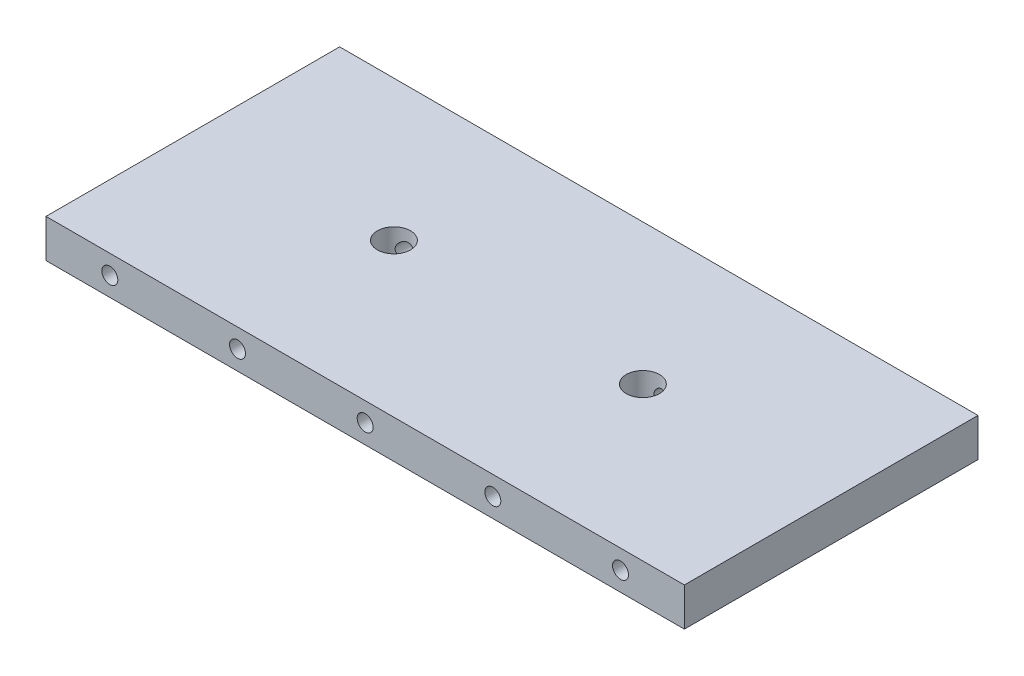
ISO-10303-21;
HEADER;
FILE_DESCRIPTION(('STEP AP214'),'2;1');
FILE_NAME('part.step','',(''),(''),'','','');
FILE_SCHEMA(('AUTOMOTIVE_DESIGN { 1 0 10303 214 1 1 1 1 }'));
ENDSEC;
DATA;
#1=APPLICATION_CONTEXT('core data for automotive mechanical design processes');
#2=APPLICATION_PROTOCOL_DEFINITION('international standard','automotive_design',2000,#1);
#3=PRODUCT_CONTEXT('',#1,'mechanical');
#4=PRODUCT('Part','Part','',(#3));
#5=PRODUCT_RELATED_PRODUCT_CATEGORY('part','',(#4));
#6=PRODUCT_DEFINITION_FORMATION('','',#4);
#7=PRODUCT_DEFINITION_CONTEXT('part definition',#1,'design');
#8=PRODUCT_DEFINITION('design','',#6,#7);
#9=PRODUCT_DEFINITION_SHAPE('','',#8);
#10=(LENGTH_UNIT() NAMED_UNIT(*) SI_UNIT(.MILLI.,.METRE.));
#11=(NAMED_UNIT(*) PLANE_ANGLE_UNIT() SI_UNIT($,.RADIAN.));
#12=(NAMED_UNIT(*) SI_UNIT($,.STERADIAN.) SOLID_ANGLE_UNIT());
#13=UNCERTAINTY_MEASURE_WITH_UNIT(LENGTH_MEASURE(1.E-05),#10,'distance_accuracy_value','');
#14=(GEOMETRIC_REPRESENTATION_CONTEXT(3) GLOBAL_UNCERTAINTY_ASSIGNED_CONTEXT((#13)) GLOBAL_UNIT_ASSIGNED_CONTEXT((#10,
#11,#12)) REPRESENTATION_CONTEXT('',''));
#15=CARTESIAN_POINT('',(0.,0.,0.));
#16=DIRECTION('',(0.,0.,1.));
#17=DIRECTION('',(1.,0.,0.));
#18=AXIS2_PLACEMENT_3D('',#15,#16,#17);
#19=CARTESIAN_POINT('',(30.,3.,-46.));
#20=DIRECTION('',(0.,0.,-1.));
#21=DIRECTION('',(-1.,0.,0.));
#22=AXIS2_PLACEMENT_3D('',#19,#20,#21);
#23=CYLINDRICAL_SURFACE('',#22,1.24999999999999);
#24=CARTESIAN_POINT('',(28.75,3.,-22.0771115476712));
#25=CARTESIAN_POINT('',(28.7500058196263,3.05987703585724,-22.0771027146161));
#26=CARTESIAN_POINT('',(28.7543421647352,3.11980777025129,-22.0731320360682));
#27=CARTESIAN_POINT('',(28.7713308446506,3.23755200681626,-22.0578820607102));
#28=CARTESIAN_POINT('',(28.7839991756404,3.29536121011062,-22.0465887060333));
#29=CARTESIAN_POINT('',(28.8166257163904,3.40677787714113,-22.0184082424711));
#30=CARTESIAN_POINT('',(28.8365173009569,3.46041846984594,-22.0015723845403));
#31=CARTESIAN_POINT('',(28.8827132550476,3.56334456186281,-21.9640067332042));
#32=CARTESIAN_POINT('',(28.9090188779373,3.61262920741274,-21.9432761789194));
#33=CARTESIAN_POINT('',(28.9714986324382,3.7132124185657,-21.8963326045757));
#34=CARTESIAN_POINT('',(29.0085444972377,3.76379900762395,-21.8697592287831));
#35=CARTESIAN_POINT('',(29.0893637553335,3.85855945770318,-21.815398537613));
#36=CARTESIAN_POINT('',(29.1331424501561,3.90272821146032,-21.7876102780682));
#37=CARTESIAN_POINT('',(29.2366305632394,3.99266753257005,-21.7266310826712));
#38=CARTESIAN_POINT('',(29.2977610488509,4.03687164981325,-21.6935144821843));
#39=CARTESIAN_POINT('',(29.4281101605905,4.11408065653992,-21.6301260094682));
#40=CARTESIAN_POINT('',(29.4973301408466,4.14708366741191,-21.5998546150422));
#41=CARTESIAN_POINT('',(29.6412244718862,4.19981082387693,-21.5447336581991));
#42=CARTESIAN_POINT('',(29.7157867400591,4.21975016511757,-21.5198010371256));
#43=CARTESIAN_POINT('',(29.8691070301464,4.24554634479766,-21.4764529226693));
#44=CARTESIAN_POINT('',(29.9478589762659,4.2514230366754,-21.4580282728137));
#45=CARTESIAN_POINT('',(30.0952843735076,4.24822891801267,-21.430753884638));
#46=CARTESIAN_POINT('',(30.1638231970346,4.24113788152117,-21.4209240165001));
#47=CARTESIAN_POINT('',(30.2993324910878,4.21558489759324,-21.4068619323081));
#48=CARTESIAN_POINT('',(30.3663034939803,4.19712686979473,-21.4026277882836));
#49=CARTESIAN_POINT('',(30.4914461857543,4.15112599823938,-21.3993161488198));
#50=CARTESIAN_POINT('',(30.5499009276847,4.12437007513587,-21.3998750609655));
#51=CARTESIAN_POINT('',(30.661913845528,4.06229518401609,-21.404440720061));
#52=CARTESIAN_POINT('',(30.7154714962641,4.02697529905785,-21.4084478363267));
#53=CARTESIAN_POINT('',(30.8182293125983,3.94730106966459,-21.4190124545881));
#54=CARTESIAN_POINT('',(30.8672037418744,3.90266768942402,-21.4256564273971));
#55=CARTESIAN_POINT('',(30.9574326014624,3.80633851796428,-21.4401469553645));
#56=CARTESIAN_POINT('',(30.9986840602304,3.75464002150327,-21.4479939713105));
#57=CARTESIAN_POINT('',(31.0748281950291,3.64198565361359,-21.4640224061928));
#58=CARTESIAN_POINT('',(31.1091705297367,3.5806551706093,-21.4721945316161));
#59=CARTESIAN_POINT('',(31.1671593404918,3.45294161834504,-21.4868747940117));
#60=CARTESIAN_POINT('',(31.1908067395724,3.38655898569192,-21.4933830745619));
#61=CARTESIAN_POINT('',(31.2266293608353,3.25062443599728,-21.5035303890284));
#62=CARTESIAN_POINT('',(31.2388181370843,3.18107636565935,-21.5071728120486));
#63=CARTESIAN_POINT('',(31.2513133946397,3.04083568013198,-21.5109090817883));
#64=CARTESIAN_POINT('',(31.2516231626388,2.97014338694246,-21.5110039100586));
#65=CARTESIAN_POINT('',(31.2405792914833,2.83253914859863,-21.5076978428573));
#66=CARTESIAN_POINT('',(31.2296777117447,2.76558694683019,-21.5044324343796));
#67=CARTESIAN_POINT('',(31.197274926575,2.63449564890732,-21.4951869622095));
#68=CARTESIAN_POINT('',(31.17577198045,2.57035701661154,-21.4892064527233));
#69=CARTESIAN_POINT('',(31.1224675475732,2.44572434744255,-21.4754609718913));
#70=CARTESIAN_POINT('',(31.090535008201,2.38528896965123,-21.4676736785254));
#71=CARTESIAN_POINT('',(31.0172916440832,2.27043918098986,-21.4517043018248));
#72=CARTESIAN_POINT('',(30.9759781717279,2.21602647637866,-21.4435221075504));
#73=CARTESIAN_POINT('',(30.8832618579287,2.11267680411272,-21.4279586942359));
#74=CARTESIAN_POINT('',(30.8315425119693,2.0640166001475,-21.420618263923));
#75=CARTESIAN_POINT('',(30.7204081907936,1.97602191601471,-21.4087579413302));
#76=CARTESIAN_POINT('',(30.6609951981736,1.93668504065965,-21.4042373241449));
#77=CARTESIAN_POINT('',(30.537982178465,1.86958356035834,-21.3995706636617));
#78=CARTESIAN_POINT('',(30.4745500905936,1.84152066549519,-21.3993034264138));
#79=CARTESIAN_POINT('',(30.3440928197504,1.79631427023646,-21.4038600722978));
#80=CARTESIAN_POINT('',(30.2770695327554,1.77916506834733,-21.4086812936294));
#81=CARTESIAN_POINT('',(30.1460632097289,1.75689961697494,-21.4234136805226));
#82=CARTESIAN_POINT('',(30.0821583476643,1.75108667272894,-21.4329811799693));
#83=CARTESIAN_POINT('',(29.9551188443754,1.74919126038185,-21.4569146336851));
#84=CARTESIAN_POINT('',(29.8919842650089,1.75310956865194,-21.4712809707322));
#85=CARTESIAN_POINT('',(29.7676853297861,1.77016366478458,-21.5044265730998));
#86=CARTESIAN_POINT('',(29.7065391252611,1.78336780795397,-21.5232378726966));
#87=CARTESIAN_POINT('',(29.5879875587455,1.81823535190435,-21.5643939843923));
#88=CARTESIAN_POINT('',(29.5305830811234,1.8399007441283,-21.5867396275985));
#89=CARTESIAN_POINT('',(29.4145673085726,1.89353052234588,-21.6364797653041));
#90=CARTESIAN_POINT('',(29.3564706628468,1.92634190471897,-21.6641582923009));
#91=CARTESIAN_POINT('',(29.2466879336826,2.00029510055344,-21.7211747310158));
#92=CARTESIAN_POINT('',(29.1950096038955,2.04144683470699,-21.7505145886216));
#93=CARTESIAN_POINT('',(29.0923051363084,2.13734817274465,-21.8131137354283));
#94=CARTESIAN_POINT('',(29.0422846325678,2.19317923031647,-21.8463740317648));
#95=CARTESIAN_POINT('',(28.9523909731607,2.31394633095729,-21.9100395967416));
#96=CARTESIAN_POINT('',(28.9125094975627,2.37887484048223,-21.9404471932494));
#97=CARTESIAN_POINT('',(28.8534783118476,2.49880414980665,-21.9875394668045));
#98=CARTESIAN_POINT('',(28.8316351654874,2.55188856625981,-22.0057265477196));
#99=CARTESIAN_POINT('',(28.7952057977608,2.66190771768464,-22.0367744842292));
#100=CARTESIAN_POINT('',(28.7806000548317,2.71883161932648,-22.0496496518341));
#101=CARTESIAN_POINT('',(28.7634353440142,2.81349221658102,-22.0649496423722));
#102=CARTESIAN_POINT('',(28.7584146178417,2.85045797193064,-22.0694814235696));
#103=CARTESIAN_POINT('',(28.7516948517786,2.92494205679741,-22.0755653871183));
#104=CARTESIAN_POINT('',(28.7499963514225,2.96246047507122,-22.0771170854986));
#105=CARTESIAN_POINT('',(28.75,3.,-22.0771115476712));
#106=B_SPLINE_CURVE_WITH_KNOTS('',3,(#24,#25,#26,#27,#28,#29,#30,#31,#32,#33,#34,#35,#36,#37,
#38,#39,#40,#41,#42,#43,#44,#45,#46,#47,#48,#49,#50,#51,#52,#53,#54,#55,#56,#57,#58,#59,#60,#61,
#62,#63,#64,#65,#66,#67,#68,#69,#70,#71,#72,#73,#74,#75,#76,#77,#78,#79,#80,#81,#82,#83,#84,#85,
#86,#87,#88,#89,#90,#91,#92,#93,#94,#95,#96,#97,#98,#99,#100,#101,#102,#103,#104,#105),
.UNSPECIFIED.,.T.,.F.,(4,2,2,2,2,2,2,2,2,2,2,2,2,2,2,2,2,2,2,2,2,2,2,2,2,2,2,2,2,2,2,2,2,2,2,2,
2,2,2,2,4),(0.,0.179458438240897,0.3592624198617,0.537448401229459,0.715669229815052,
0.919259460265815,1.1230108292018,1.36900509227057,1.6150405922963,1.85691386836441,
2.09844546936989,2.30612075600796,2.51372447080579,2.70572756109149,2.89775121820081,
3.09667500679983,3.29567517810007,3.50697042179924,3.71824742604985,3.92927420135033,
4.14024258918958,4.3430256653889,4.54584204869602,4.75131182380522,4.95683966151898,
5.16996489942484,5.38303532540832,5.59002338618605,5.79690322402102,5.99060939890406,
6.18433102839791,6.37949382310879,6.57470257912201,6.79056023524063,7.00667617301181,
7.25160680945442,7.49633580606454,7.67633550832431,7.85584701515501,7.9683390686407,
8.08084938949368),.UNSPECIFIED.);
#107=CARTESIAN_POINT('',(28.75,3.,-22.0771115476712));
#108=VERTEX_POINT('',#107);
#109=EDGE_CURVE('E48',#108,#108,#106,.T.);
#110=ORIENTED_EDGE('',*,*,#109,.T.);
#111=EDGE_LOOP('',(#110));
#112=FACE_BOUND('',#111,.T.);
#113=CARTESIAN_POINT('',(30.,3.,0.));
#114=DIRECTION('',(0.,0.,-1.));
#115=DIRECTION('',(-1.,0.,0.));
#116=AXIS2_PLACEMENT_3D('',#113,#114,#115);
#117=CIRCLE('',#116,1.24999999999999);
#118=CARTESIAN_POINT('',(28.75,3.,0.));
#119=VERTEX_POINT('',#118);
#120=EDGE_CURVE('E190',#119,#119,#117,.T.);
#121=ORIENTED_EDGE('',*,*,#120,.F.);
#122=EDGE_LOOP('',(#121));
#123=FACE_BOUND('',#122,.T.);
#124=ADVANCED_FACE('F44',(#112,#123),#23,.F.);
#125=CARTESIAN_POINT('',(70.,3.,-46.));
#126=DIRECTION('',(0.,0.,-1.));
#127=DIRECTION('',(-1.,0.,0.));
#128=AXIS2_PLACEMENT_3D('',#125,#126,#127);
#129=CYLINDRICAL_SURFACE('',#128,1.24999999999999);
#130=CARTESIAN_POINT('',(68.75,3.,-21.510522143096));
#131=CARTESIAN_POINT('',(68.7500029943981,3.06890975361375,-21.5105190031132));
#132=CARTESIAN_POINT('',(68.755720606154,3.13785424207172,-21.5087765976842));
#133=CARTESIAN_POINT('',(68.7783952951011,3.27374705363215,-21.5021168893944));
#134=CARTESIAN_POINT('',(68.7953629265432,3.34069344051679,-21.4971966053063));
#135=CARTESIAN_POINT('',(68.839926551577,3.47056740882212,-21.4850782916616));
#136=CARTESIAN_POINT('',(68.8675011974563,3.5335027681749,-21.4778848422426));
#137=CARTESIAN_POINT('',(68.9324947069875,3.65392385273945,-21.4624718728743));
#138=CARTESIAN_POINT('',(68.9699146573804,3.71140897539163,-21.4542522397057));
#139=CARTESIAN_POINT('',(69.0548493775154,3.82105520770384,-21.4380167559006));
#140=CARTESIAN_POINT('',(69.1026170185198,3.87302265315256,-21.4300130183405));
#141=CARTESIAN_POINT('',(69.2063862415094,3.9683165404392,-21.4161026691012));
#142=CARTESIAN_POINT('',(69.2623870124503,4.01164383242772,-21.4101958510502));
#143=CARTESIAN_POINT('',(69.3804449451788,4.08790268491019,-21.4020848478843));
#144=CARTESIAN_POINT('',(69.4424274450839,4.12094499187548,-21.3998400292083));
#145=CARTESIAN_POINT('',(69.5710325772768,4.17617034688676,-21.4001773894551));
#146=CARTESIAN_POINT('',(69.6376525230749,4.19835962330586,-21.4027567957258));
#147=CARTESIAN_POINT('',(69.768793176282,4.23016124420021,-21.4131501090985));
#148=CARTESIAN_POINT('',(69.8331666720931,4.24050056538077,-21.420611020193));
#149=CARTESIAN_POINT('',(69.9619569394055,4.251090425533,-21.4405390653981));
#150=CARTESIAN_POINT('',(70.0263737089345,4.25134139673459,-21.4530059850058));
#151=CARTESIAN_POINT('',(70.1524825426967,4.24225263041764,-21.4823816229431));
#152=CARTESIAN_POINT('',(70.2142004427138,4.23305048020037,-21.4992240280758));
#153=CARTESIAN_POINT('',(70.3344724187713,4.20599812391164,-21.5367441055227));
#154=CARTESIAN_POINT('',(70.3930257571915,4.18814591119841,-21.5574226670613));
#155=CARTESIAN_POINT('',(70.5109017272889,4.14272163429358,-21.603663369733));
#156=CARTESIAN_POINT('',(70.5698416360631,4.11443455718747,-21.6294947347101));
#157=CARTESIAN_POINT('',(70.6819266510362,4.04960707032788,-21.6833377202969));
#158=CARTESIAN_POINT('',(70.7350665176714,4.0130592881549,-21.711351273715));
#159=CARTESIAN_POINT('',(70.8417965025281,3.92693611060534,-21.7720306920261));
#160=CARTESIAN_POINT('',(70.8944383681792,3.87625925383686,-21.8048054339634));
#161=CARTESIAN_POINT('',(70.9905192393828,3.76597544864826,-21.8688774713846));
#162=CARTESIAN_POINT('',(71.0339593768587,3.70636960014335,-21.9001749482214));
#163=CARTESIAN_POINT('',(71.1029092539253,3.59132283901708,-21.9525197513522));
#164=CARTESIAN_POINT('',(71.1302646739285,3.53735796265971,-21.9743735152552));
#165=CARTESIAN_POINT('',(71.1772804309533,3.42453373505043,-22.0131278406212));
#166=CARTESIAN_POINT('',(71.1969546713728,3.36568346309593,-22.0300373374396));
#167=CARTESIAN_POINT('',(71.2250511798699,3.25398587089513,-22.0546229182559));
#168=CARTESIAN_POINT('',(71.2347768143387,3.20170222117255,-22.0633486379682));
#169=CARTESIAN_POINT('',(71.2474724794652,3.09568381378751,-22.0747943153332));
#170=CARTESIAN_POINT('',(71.2504482700411,3.04195033298267,-22.077519393521));
#171=CARTESIAN_POINT('',(71.2494413998835,2.93456263908586,-22.0766032946155));
#172=CARTESIAN_POINT('',(71.2454531751938,2.88090852368576,-22.0729570270823));
#173=CARTESIAN_POINT('',(71.2307885250924,2.77524986129374,-22.0597773197397));
#174=CARTESIAN_POINT('',(71.2201049934108,2.72324712874242,-22.0502376249133));
#175=CARTESIAN_POINT('',(71.1894103804341,2.6101282134414,-22.0235400558191));
#176=CARTESIAN_POINT('',(71.1677947517706,2.54975140510279,-22.0051168680649));
#177=CARTESIAN_POINT('',(71.1165054747258,2.43438811566615,-21.9633360327954));
#178=CARTESIAN_POINT('',(71.0868209136891,2.37940907273148,-21.9399717123196));
#179=CARTESIAN_POINT('',(71.0198214443312,2.27446351809784,-21.8900434290406));
#180=CARTESIAN_POINT('',(70.9823869074272,2.22459654493037,-21.8634323732491));
#181=CARTESIAN_POINT('',(70.9009169443394,2.13127249812033,-21.8091481980003));
#182=CARTESIAN_POINT('',(70.8568805761122,2.08781634102293,-21.781474927391));
#183=CARTESIAN_POINT('',(70.7524342879928,1.99899619111893,-21.7205684054907));
#184=CARTESIAN_POINT('',(70.6905473029951,1.9552789925552,-21.6874372656077));
#185=CARTESIAN_POINT('',(70.5586864180588,1.87921526789223,-21.6241783996152));
#186=CARTESIAN_POINT('',(70.4887103035937,1.84687186539097,-21.5940515001885));
#187=CARTESIAN_POINT('',(70.343948287317,1.7958662522461,-21.5395980709348));
#188=CARTESIAN_POINT('',(70.2693224121486,1.77688799689254,-21.5151474193448));
#189=CARTESIAN_POINT('',(70.1160850559113,1.75299841305473,-21.4728024787578));
#190=CARTESIAN_POINT('',(70.0374794333497,1.74806698602185,-21.4548988541389));
#191=CARTESIAN_POINT('',(69.8905747357067,1.75294419904391,-21.4285752131375));
#192=CARTESIAN_POINT('',(69.8223814301931,1.76077677922541,-21.419175362785));
#193=CARTESIAN_POINT('',(69.6877043909029,1.78769632892217,-21.4059031440015));
#194=CARTESIAN_POINT('',(69.6212201278986,1.80677976955731,-21.4020290436977));
#195=CARTESIAN_POINT('',(69.4968525696991,1.85394098589194,-21.3993097638098));
#196=CARTESIAN_POINT('',(69.4386939310649,1.88128152143709,-21.4001261259258));
#197=CARTESIAN_POINT('',(69.3273648520027,1.94446249701398,-21.4051388944166));
#198=CARTESIAN_POINT('',(69.2741948777348,1.98030373028209,-21.4093356163147));
#199=CARTESIAN_POINT('',(69.1721733064649,2.06106555398765,-21.4202199323411));
#200=CARTESIAN_POINT('',(69.1235658571883,2.10628188123292,-21.4269969669228));
#201=CARTESIAN_POINT('',(69.0341602029409,2.20373979537372,-21.4416703976158));
#202=CARTESIAN_POINT('',(68.9933663256225,2.25598524833212,-21.4495674098522));
#203=CARTESIAN_POINT('',(68.9182863306305,2.36967065974244,-21.4656016536442));
#204=CARTESIAN_POINT('',(68.8845512759908,2.43147763902106,-21.4737240090184));
#205=CARTESIAN_POINT('',(68.8278934234811,2.56001318227051,-21.4882008295455));
#206=CARTESIAN_POINT('',(68.8049597185568,2.62673670248619,-21.4945570754198));
#207=CARTESIAN_POINT('',(68.7752688816104,2.7447192904278,-21.5030159067373));
#208=CARTESIAN_POINT('',(68.7658114457587,2.79526495983296,-21.5058045819091));
#209=CARTESIAN_POINT('',(68.7531761356117,2.89720068660773,-21.5095587994696));
#210=CARTESIAN_POINT('',(68.749997766064,2.9485906770603,-21.5105244856438));
#211=CARTESIAN_POINT('',(68.75,3.,-21.510522143096));
#212=B_SPLINE_CURVE_WITH_KNOTS('',3,(#130,#131,#132,#133,#134,#135,#136,#137,#138,#139,#140,
#141,#142,#143,#144,#145,#146,#147,#148,#149,#150,#151,#152,#153,#154,#155,#156,#157,#158,#159,
#160,#161,#162,#163,#164,#165,#166,#167,#168,#169,#170,#171,#172,#173,#174,#175,#176,#177,#178,
#179,#180,#181,#182,#183,#184,#185,#186,#187,#188,#189,#190,#191,#192,#193,#194,#195,#196,#197,
#198,#199,#200,#201,#202,#203,#204,#205,#206,#207,#208,#209,#210,#211),.UNSPECIFIED.,.T.,.F.,(4,
2,2,2,2,2,2,2,2,2,2,2,2,2,2,2,2,2,2,2,2,2,2,2,2,2,2,2,2,2,2,2,2,2,2,2,2,2,2,2,4),(0.,
0.206536467885013,0.413266973468789,0.619583571237635,0.825922952133616,1.03802832296797,
1.25011281331911,1.45982759893621,1.66942189111262,1.86532274341884,2.0612152024497,
2.25429635303376,2.44742231604918,2.65748215741375,2.86773021605184,3.10696871083471,
3.34617775929149,3.53847013530774,3.73041281872086,3.89138334463367,4.05221645604353,
4.21317812517169,4.37431092593236,4.57340628874115,4.77277226515607,4.97548208779362,
5.17822086353591,5.42512684000164,5.67210057166543,5.91301794135081,6.15359042693985,
6.3603187351133,6.56698223654641,6.75892951200581,6.95089470593645,7.15022952899009,
7.3496744390807,7.56132532778966,7.77276203367611,7.92685832615726,8.08094246402607),.UNSPECIFIED.);
#213=CARTESIAN_POINT('',(68.75,3.,-21.510522143096));
#214=VERTEX_POINT('',#213);
#215=EDGE_CURVE('E133',#214,#214,#212,.T.);
#216=ORIENTED_EDGE('',*,*,#215,.T.);
#217=EDGE_LOOP('',(#216));
#218=FACE_BOUND('',#217,.T.);
#219=CARTESIAN_POINT('',(70.,3.,0.));
#220=DIRECTION('',(0.,0.,-1.));
#221=DIRECTION('',(-1.,0.,0.));
#222=AXIS2_PLACEMENT_3D('',#219,#220,#221);
#223=CIRCLE('',#222,1.24999999999999);
#224=CARTESIAN_POINT('',(68.75,3.,0.));
#225=VERTEX_POINT('',#224);
#226=EDGE_CURVE('E235',#225,#225,#223,.T.);
#227=ORIENTED_EDGE('',*,*,#226,.F.);
#228=EDGE_LOOP('',(#227));
#229=FACE_BOUND('',#228,.T.);
#230=ADVANCED_FACE('F159',(#218,#229),#129,.F.);
#231=CARTESIAN_POINT('',(0.,6.,0.));
#232=DIRECTION('',(1.,0.,0.));
#233=DIRECTION('',(0.,0.,-1.));
#234=AXIS2_PLACEMENT_3D('',#231,#232,#233);
#235=PLANE('',#234);
#236=DIRECTION('',(0.,0.,1.));
#237=VECTOR('',#236,1.);
#238=CARTESIAN_POINT('',(0.,0.,0.));
#239=LINE('',#238,#237);
#240=CARTESIAN_POINT('',(0.,0.,-46.));
#241=VERTEX_POINT('',#240);
#242=CARTESIAN_POINT('',(0.,0.,0.));
#243=VERTEX_POINT('',#242);
#244=EDGE_CURVE('E116',#241,#243,#239,.T.);
#245=ORIENTED_EDGE('',*,*,#244,.T.);
#246=DIRECTION('',(0.,-1.,0.));
#247=VECTOR('',#246,1.);
#248=CARTESIAN_POINT('',(0.,6.,0.));
#249=LINE('',#248,#247);
#250=CARTESIAN_POINT('',(0.,6.,0.));
#251=VERTEX_POINT('',#250);
#252=EDGE_CURVE('E11',#251,#243,#249,.T.);
#253=ORIENTED_EDGE('',*,*,#252,.F.);
#254=DIRECTION('',(0.,0.,1.));
#255=VECTOR('',#254,1.);
#256=CARTESIAN_POINT('',(0.,6.,0.));
#257=LINE('',#256,#255);
#258=CARTESIAN_POINT('',(0.,6.,-46.));
#259=VERTEX_POINT('',#258);
#260=EDGE_CURVE('E103',#259,#251,#257,.T.);
#261=ORIENTED_EDGE('',*,*,#260,.F.);
#262=DIRECTION('',(0.,-1.,0.));
#263=VECTOR('',#262,1.);
#264=CARTESIAN_POINT('',(0.,6.,-46.));
#265=LINE('',#264,#263);
#266=EDGE_CURVE('E112',#259,#241,#265,.T.);
#267=ORIENTED_EDGE('',*,*,#266,.T.);
#268=EDGE_LOOP('',(#245,#253,#261,#267));
#269=FACE_BOUND('',#268,.T.);
#270=ADVANCED_FACE('F46',(#269),#235,.F.);
#271=CARTESIAN_POINT('',(0.,6.,0.));
#272=DIRECTION('',(0.,0.,-1.));
#273=DIRECTION('',(-1.,0.,0.));
#274=AXIS2_PLACEMENT_3D('',#271,#272,#273);
#275=PLANE('',#274);
#276=CARTESIAN_POINT('',(90.,3.,0.));
#277=DIRECTION('',(0.,0.,-1.));
#278=DIRECTION('',(-1.,0.,0.));
#279=AXIS2_PLACEMENT_3D('',#276,#277,#278);
#280=CIRCLE('',#279,1.24999999999999);
#281=CARTESIAN_POINT('',(88.75,3.,0.));
#282=VERTEX_POINT('',#281);
#283=EDGE_CURVE('E231',#282,#282,#280,.T.);
#284=ORIENTED_EDGE('',*,*,#283,.T.);
#285=EDGE_LOOP('',(#284));
#286=FACE_BOUND('',#285,.T.);
#287=ORIENTED_EDGE('',*,*,#226,.T.);
#288=EDGE_LOOP('',(#287));
#289=FACE_BOUND('',#288,.T.);
#290=CARTESIAN_POINT('',(50.,3.,0.));
#291=DIRECTION('',(0.,0.,-1.));
#292=DIRECTION('',(-1.,0.,0.));
#293=AXIS2_PLACEMENT_3D('',#290,#291,#292);
#294=CIRCLE('',#293,1.24999999999999);
#295=CARTESIAN_POINT('',(48.75,3.,0.));
#296=VERTEX_POINT('',#295);
#297=EDGE_CURVE('E191',#296,#296,#294,.T.);
#298=ORIENTED_EDGE('',*,*,#297,.T.);
#299=EDGE_LOOP('',(#298));
#300=FACE_BOUND('',#299,.T.);
#301=ORIENTED_EDGE('',*,*,#120,.T.);
#302=EDGE_LOOP('',(#301));
#303=FACE_BOUND('',#302,.T.);
#304=CARTESIAN_POINT('',(9.99999999999999,3.,0.));
#305=DIRECTION('',(0.,0.,-1.));
#306=DIRECTION('',(-1.,0.,0.));
#307=AXIS2_PLACEMENT_3D('',#304,#305,#306);
#308=CIRCLE('',#307,1.24999999999999);
#309=CARTESIAN_POINT('',(8.75,3.,0.));
#310=VERTEX_POINT('',#309);
#311=EDGE_CURVE('E119',#310,#310,#308,.T.);
#312=ORIENTED_EDGE('',*,*,#311,.T.);
#313=EDGE_LOOP('',(#312));
#314=FACE_BOUND('',#313,.T.);
#315=DIRECTION('',(1.,0.,0.));
#316=VECTOR('',#315,1.);
#317=CARTESIAN_POINT('',(0.,0.,0.));
#318=LINE('',#317,#316);
#319=CARTESIAN_POINT('',(100.,0.,0.));
#320=VERTEX_POINT('',#319);
#321=EDGE_CURVE('E107',#243,#320,#318,.T.);
#322=ORIENTED_EDGE('',*,*,#321,.T.);
#323=DIRECTION('',(0.,-1.,0.));
#324=VECTOR('',#323,1.);
#325=CARTESIAN_POINT('',(100.,6.,0.));
#326=LINE('',#325,#324);
#327=CARTESIAN_POINT('',(100.,6.,0.));
#328=VERTEX_POINT('',#327);
#329=EDGE_CURVE('E59',#328,#320,#326,.T.);
#330=ORIENTED_EDGE('',*,*,#329,.F.);
#331=DIRECTION('',(1.,0.,0.));
#332=VECTOR('',#331,1.);
#333=CARTESIAN_POINT('',(0.,6.,0.));
#334=LINE('',#333,#332);
#335=EDGE_CURVE('E98',#251,#328,#334,.T.);
#336=ORIENTED_EDGE('',*,*,#335,.F.);
#337=ORIENTED_EDGE('',*,*,#252,.T.);
#338=EDGE_LOOP('',(#322,#330,#336,#337));
#339=FACE_BOUND('',#338,.T.);
#340=ADVANCED_FACE('F106',(#286,#289,#300,#303,#314,#339),#275,.F.);
#341=CARTESIAN_POINT('',(100.,6.,0.));
#342=DIRECTION('',(-1.,0.,0.));
#343=DIRECTION('',(0.,0.,1.));
#344=AXIS2_PLACEMENT_3D('',#341,#342,#343);
#345=PLANE('',#344);
#346=DIRECTION('',(0.,0.,-1.));
#347=VECTOR('',#346,1.);
#348=CARTESIAN_POINT('',(100.,0.,0.));
#349=LINE('',#348,#347);
#350=CARTESIAN_POINT('',(100.,0.,-46.));
#351=VERTEX_POINT('',#350);
#352=EDGE_CURVE('E85',#320,#351,#349,.T.);
#353=ORIENTED_EDGE('',*,*,#352,.T.);
#354=DIRECTION('',(0.,-1.,0.));
#355=VECTOR('',#354,1.);
#356=CARTESIAN_POINT('',(100.,6.,-46.));
#357=LINE('',#356,#355);
#358=CARTESIAN_POINT('',(100.,6.,-46.));
#359=VERTEX_POINT('',#358);
#360=EDGE_CURVE('E108',#359,#351,#357,.T.);
#361=ORIENTED_EDGE('',*,*,#360,.F.);
#362=DIRECTION('',(0.,0.,-1.));
#363=VECTOR('',#362,1.);
#364=CARTESIAN_POINT('',(100.,6.,0.));
#365=LINE('',#364,#363);
#366=EDGE_CURVE('E101',#328,#359,#365,.T.);
#367=ORIENTED_EDGE('',*,*,#366,.F.);
#368=ORIENTED_EDGE('',*,*,#329,.T.);
#369=EDGE_LOOP('',(#353,#361,#367,#368));
#370=FACE_BOUND('',#369,.T.);
#371=ADVANCED_FACE('F110',(#370),#345,.F.);
#372=CARTESIAN_POINT('',(0.,6.,-46.));
#373=DIRECTION('',(0.,0.,1.));
#374=DIRECTION('',(1.,0.,0.));
#375=AXIS2_PLACEMENT_3D('',#372,#373,#374);
#376=PLANE('',#375);
#377=CARTESIAN_POINT('',(90.,3.,-46.));
#378=DIRECTION('',(0.,0.,-1.));
#379=DIRECTION('',(-1.,0.,0.));
#380=AXIS2_PLACEMENT_3D('',#377,#378,#379);
#381=CIRCLE('',#380,1.24999999999999);
#382=CARTESIAN_POINT('',(88.75,3.,-46.));
#383=VERTEX_POINT('',#382);
#384=EDGE_CURVE('E249',#383,#383,#381,.T.);
#385=ORIENTED_EDGE('',*,*,#384,.F.);
#386=EDGE_LOOP('',(#385));
#387=FACE_BOUND('',#386,.T.);
#388=CARTESIAN_POINT('',(70.,3.,-46.));
#389=DIRECTION('',(0.,0.,-1.));
#390=DIRECTION('',(-1.,0.,0.));
#391=AXIS2_PLACEMENT_3D('',#388,#389,#390);
#392=CIRCLE('',#391,1.24999999999999);
#393=CARTESIAN_POINT('',(68.75,3.,-46.));
#394=VERTEX_POINT('',#393);
#395=EDGE_CURVE('E243',#394,#394,#392,.T.);
#396=ORIENTED_EDGE('',*,*,#395,.F.);
#397=EDGE_LOOP('',(#396));
#398=FACE_BOUND('',#397,.T.);
#399=CARTESIAN_POINT('',(50.,3.,-46.));
#400=DIRECTION('',(0.,0.,-1.));
#401=DIRECTION('',(-1.,0.,0.));
#402=AXIS2_PLACEMENT_3D('',#399,#400,#401);
#403=CIRCLE('',#402,1.24999999999999);
#404=CARTESIAN_POINT('',(48.75,3.,-46.));
#405=VERTEX_POINT('',#404);
#406=EDGE_CURVE('E197',#405,#405,#403,.T.);
#407=ORIENTED_EDGE('',*,*,#406,.F.);
#408=EDGE_LOOP('',(#407));
#409=FACE_BOUND('',#408,.T.);
#410=CARTESIAN_POINT('',(30.,3.,-46.));
#411=DIRECTION('',(0.,0.,-1.));
#412=DIRECTION('',(-1.,0.,0.));
#413=AXIS2_PLACEMENT_3D('',#410,#411,#412);
#414=CIRCLE('',#413,1.24999999999999);
#415=CARTESIAN_POINT('',(28.75,3.,-46.));
#416=VERTEX_POINT('',#415);
#417=EDGE_CURVE('E188',#416,#416,#414,.T.);
#418=ORIENTED_EDGE('',*,*,#417,.F.);
#419=EDGE_LOOP('',(#418));
#420=FACE_BOUND('',#419,.T.);
#421=CARTESIAN_POINT('',(9.99999999999999,3.,-46.));
#422=DIRECTION('',(0.,0.,-1.));
#423=DIRECTION('',(-1.,0.,0.));
#424=AXIS2_PLACEMENT_3D('',#421,#422,#423);
#425=CIRCLE('',#424,1.24999999999999);
#426=CARTESIAN_POINT('',(8.75000000000001,3.,-46.));
#427=VERTEX_POINT('',#426);
#428=EDGE_CURVE('E194',#427,#427,#425,.T.);
#429=ORIENTED_EDGE('',*,*,#428,.F.);
#430=EDGE_LOOP('',(#429));
#431=FACE_BOUND('',#430,.T.);
#432=DIRECTION('',(-1.,0.,0.));
#433=VECTOR('',#432,1.);
#434=CARTESIAN_POINT('',(0.,0.,-46.));
#435=LINE('',#434,#433);
#436=EDGE_CURVE('E91',#351,#241,#435,.T.);
#437=ORIENTED_EDGE('',*,*,#436,.T.);
#438=ORIENTED_EDGE('',*,*,#266,.F.);
#439=DIRECTION('',(-1.,0.,0.));
#440=VECTOR('',#439,1.);
#441=CARTESIAN_POINT('',(0.,6.,-46.));
#442=LINE('',#441,#440);
#443=EDGE_CURVE('E68',#359,#259,#442,.T.);
#444=ORIENTED_EDGE('',*,*,#443,.F.);
#445=ORIENTED_EDGE('',*,*,#360,.T.);
#446=EDGE_LOOP('',(#437,#438,#444,#445));
#447=FACE_BOUND('',#446,.T.);
#448=ADVANCED_FACE('F209',(#387,#398,#409,#420,#431,#447),#376,.F.);
#449=CARTESIAN_POINT('',(0.,6.,0.));
#450=DIRECTION('',(0.,-1.,0.));
#451=DIRECTION('',(0.,0.,-1.));
#452=AXIS2_PLACEMENT_3D('',#449,#450,#451);
#453=PLANE('',#452);
#454=CARTESIAN_POINT('',(30.4999999999769,6.,-23.9999999999952));
#455=DIRECTION('',(0.,1.,0.));
#456=DIRECTION('',(0.,0.,1.));
#457=AXIS2_PLACEMENT_3D('',#454,#455,#456);
#458=CIRCLE('',#457,2.6);
#459=CARTESIAN_POINT('',(30.4999999999769,6.,-21.3999999999952));
#460=VERTEX_POINT('',#459);
#461=EDGE_CURVE('E260',#460,#460,#458,.T.);
#462=ORIENTED_EDGE('',*,*,#461,.F.);
#463=EDGE_LOOP('',(#462));
#464=FACE_BOUND('',#463,.T.);
#465=CARTESIAN_POINT('',(69.5000000000047,6.,-23.9999999999955));
#466=DIRECTION('',(0.,1.,0.));
#467=DIRECTION('',(0.,0.,1.));
#468=AXIS2_PLACEMENT_3D('',#465,#466,#467);
#469=CIRCLE('',#468,2.6);
#470=CARTESIAN_POINT('',(69.5000000000047,6.,-21.3999999999955));
#471=VERTEX_POINT('',#470);
#472=EDGE_CURVE('E254',#471,#471,#469,.T.);
#473=ORIENTED_EDGE('',*,*,#472,.F.);
#474=EDGE_LOOP('',(#473));
#475=FACE_BOUND('',#474,.T.);
#476=ORIENTED_EDGE('',*,*,#260,.T.);
#477=ORIENTED_EDGE('',*,*,#335,.T.);
#478=ORIENTED_EDGE('',*,*,#366,.T.);
#479=ORIENTED_EDGE('',*,*,#443,.T.);
#480=EDGE_LOOP('',(#476,#477,#478,#479));
#481=FACE_BOUND('',#480,.T.);
#482=ADVANCED_FACE('F99',(#464,#475,#481),#453,.F.);
#483=CARTESIAN_POINT('',(0.,0.,0.));
#484=DIRECTION('',(0.,-1.,0.));
#485=DIRECTION('',(0.,0.,-1.));
#486=AXIS2_PLACEMENT_3D('',#483,#484,#485);
#487=PLANE('',#486);
#488=CARTESIAN_POINT('',(30.4999999999769,0.,-23.9999999999952));
#489=DIRECTION('',(0.,1.,0.));
#490=DIRECTION('',(0.,0.,1.));
#491=AXIS2_PLACEMENT_3D('',#488,#489,#490);
#492=CIRCLE('',#491,2.6);
#493=CARTESIAN_POINT('',(30.4999999999769,0.,-21.3999999999952));
#494=VERTEX_POINT('',#493);
#495=EDGE_CURVE('E257',#494,#494,#492,.T.);
#496=ORIENTED_EDGE('',*,*,#495,.T.);
#497=EDGE_LOOP('',(#496));
#498=FACE_BOUND('',#497,.T.);
#499=CARTESIAN_POINT('',(69.5000000000047,0.,-23.9999999999955));
#500=DIRECTION('',(0.,1.,0.));
#501=DIRECTION('',(0.,0.,1.));
#502=AXIS2_PLACEMENT_3D('',#499,#500,#501);
#503=CIRCLE('',#502,2.6);
#504=CARTESIAN_POINT('',(69.5000000000047,0.,-21.3999999999955));
#505=VERTEX_POINT('',#504);
#506=EDGE_CURVE('E134',#505,#505,#503,.T.);
#507=ORIENTED_EDGE('',*,*,#506,.T.);
#508=EDGE_LOOP('',(#507));
#509=FACE_BOUND('',#508,.T.);
#510=ORIENTED_EDGE('',*,*,#244,.F.);
#511=ORIENTED_EDGE('',*,*,#436,.F.);
#512=ORIENTED_EDGE('',*,*,#352,.F.);
#513=ORIENTED_EDGE('',*,*,#321,.F.);
#514=EDGE_LOOP('',(#510,#511,#512,#513));
#515=FACE_BOUND('',#514,.T.);
#516=ADVANCED_FACE('F180',(#498,#509,#515),#487,.T.);
#517=CARTESIAN_POINT('',(9.99999999999999,3.,-46.));
#518=DIRECTION('',(0.,0.,-1.));
#519=DIRECTION('',(-1.,0.,0.));
#520=AXIS2_PLACEMENT_3D('',#517,#518,#519);
#521=CYLINDRICAL_SURFACE('',#520,1.24999999999999);
#522=ORIENTED_EDGE('',*,*,#311,.F.);
#523=EDGE_LOOP('',(#522));
#524=FACE_BOUND('',#523,.T.);
#525=ORIENTED_EDGE('',*,*,#428,.T.);
#526=EDGE_LOOP('',(#525));
#527=FACE_BOUND('',#526,.T.);
#528=ADVANCED_FACE('F173',(#524,#527),#521,.F.);
#529=CARTESIAN_POINT('',(28.75,3.,-25.9228884523192));
#530=CARTESIAN_POINT('',(28.7500058196263,2.94012296414276,-25.9228972853743));
#531=CARTESIAN_POINT('',(28.7543421647352,2.88019222974871,-25.9268679639221));
#532=CARTESIAN_POINT('',(28.7713308446506,2.76244799318374,-25.9421179392801));
#533=CARTESIAN_POINT('',(28.7839991756404,2.70463878988938,-25.9534112939571));
#534=CARTESIAN_POINT('',(28.8166257163904,2.59322212285886,-25.9815917575192));
#535=CARTESIAN_POINT('',(28.8365173009569,2.53958153015406,-25.9984276154501));
#536=CARTESIAN_POINT('',(28.8827132550476,2.43665543813718,-26.0359932667862));
#537=CARTESIAN_POINT('',(28.9090188779373,2.38737079258726,-26.056723821071));
#538=CARTESIAN_POINT('',(28.9714986324382,2.2867875814343,-26.1036673954147));
#539=CARTESIAN_POINT('',(29.0085444972377,2.23620099237605,-26.1302407712073));
#540=CARTESIAN_POINT('',(29.0893637553335,2.14144054229682,-26.1846014623773));
#541=CARTESIAN_POINT('',(29.1331424501561,2.09727178853968,-26.2123897219221));
#542=CARTESIAN_POINT('',(29.2366305632394,2.00733246742995,-26.2733689173192));
#543=CARTESIAN_POINT('',(29.2977610488509,1.96312835018675,-26.3064855178061));
#544=CARTESIAN_POINT('',(29.4281101605905,1.88591934346008,-26.3698739905222));
#545=CARTESIAN_POINT('',(29.4973301408466,1.85291633258809,-26.4001453849482));
#546=CARTESIAN_POINT('',(29.6412244718862,1.80018917612307,-26.4552663417912));
#547=CARTESIAN_POINT('',(29.7157867400591,1.78024983488243,-26.4801989628648));
#548=CARTESIAN_POINT('',(29.8691070301464,1.75445365520234,-26.523547077321));
#549=CARTESIAN_POINT('',(29.9478589762659,1.7485769633246,-26.5419717271766));
#550=CARTESIAN_POINT('',(30.0952843735076,1.75177108198733,-26.5692461153524));
#551=CARTESIAN_POINT('',(30.1638231970346,1.75886211847883,-26.5790759834902));
#552=CARTESIAN_POINT('',(30.2993324910878,1.78441510240676,-26.5931380676822));
#553=CARTESIAN_POINT('',(30.3663034939803,1.80287313020527,-26.5973722117067));
#554=CARTESIAN_POINT('',(30.4914461857543,1.84887400176062,-26.6006838511705));
#555=CARTESIAN_POINT('',(30.5499009276847,1.87562992486413,-26.6001249390249));
#556=CARTESIAN_POINT('',(30.661913845528,1.93770481598391,-26.5955592799294));
#557=CARTESIAN_POINT('',(30.7154714962641,1.97302470094215,-26.5915521636636));
#558=CARTESIAN_POINT('',(30.8182293125983,2.05269893033542,-26.5809875454023));
#559=CARTESIAN_POINT('',(30.8672037418744,2.09733231057598,-26.5743435725933));
#560=CARTESIAN_POINT('',(30.9574326014624,2.19366148203571,-26.5598530446259));
#561=CARTESIAN_POINT('',(30.9986840602304,2.24535997849673,-26.5520060286798));
#562=CARTESIAN_POINT('',(31.0748281950291,2.35801434638641,-26.5359775937976));
#563=CARTESIAN_POINT('',(31.1091705297367,2.4193448293907,-26.5278054683743));
#564=CARTESIAN_POINT('',(31.1671593404918,2.54705838165496,-26.5131252059787));
#565=CARTESIAN_POINT('',(31.1908067395724,2.61344101430808,-26.5066169254284));
#566=CARTESIAN_POINT('',(31.2266293608353,2.74937556400272,-26.496469610962));
#567=CARTESIAN_POINT('',(31.2388181370843,2.81892363434065,-26.4928271879417));
#568=CARTESIAN_POINT('',(31.2513133946397,2.95916431986801,-26.489090918202));
#569=CARTESIAN_POINT('',(31.2516231626388,3.02985661305754,-26.4889960899317));
#570=CARTESIAN_POINT('',(31.2405792914833,3.16746085140137,-26.492302157133));
#571=CARTESIAN_POINT('',(31.2296777117447,3.2344130531698,-26.4955675656107));
#572=CARTESIAN_POINT('',(31.197274926575,3.36550435109268,-26.5048130377808));
#573=CARTESIAN_POINT('',(31.17577198045,3.42964298338846,-26.5107935472671));
#574=CARTESIAN_POINT('',(31.1224675475732,3.55427565255745,-26.524539028099));
#575=CARTESIAN_POINT('',(31.090535008201,3.61471103034877,-26.532326321465));
#576=CARTESIAN_POINT('',(31.0172916440832,3.72956081901014,-26.5482956981656));
#577=CARTESIAN_POINT('',(30.9759781717279,3.78397352362134,-26.55647789244));
#578=CARTESIAN_POINT('',(30.8832618579287,3.88732319588728,-26.5720413057545));
#579=CARTESIAN_POINT('',(30.8315425119693,3.9359833998525,-26.5793817360674));
#580=CARTESIAN_POINT('',(30.7204081907936,4.02397808398529,-26.5912420586602));
#581=CARTESIAN_POINT('',(30.6609951981736,4.06331495934035,-26.5957626758455));
#582=CARTESIAN_POINT('',(30.537982178465,4.13041643964165,-26.6004293363286));
#583=CARTESIAN_POINT('',(30.4745500905936,4.15847933450481,-26.6006965735766));
#584=CARTESIAN_POINT('',(30.3440928197504,4.20368572976354,-26.5961399276925));
#585=CARTESIAN_POINT('',(30.2770695327554,4.22083493165266,-26.5913187063609));
#586=CARTESIAN_POINT('',(30.1460632097289,4.24310038302506,-26.5765863194677));
#587=CARTESIAN_POINT('',(30.0821583476643,4.24891332727106,-26.5670188200211));
#588=CARTESIAN_POINT('',(29.9551188443754,4.25080873961815,-26.5430853663053));
#589=CARTESIAN_POINT('',(29.8919842650089,4.24689043134806,-26.5287190292582));
#590=CARTESIAN_POINT('',(29.7676853297861,4.22983633521542,-26.4955734268906));
#591=CARTESIAN_POINT('',(29.7065391252611,4.21663219204603,-26.4767621272938));
#592=CARTESIAN_POINT('',(29.5879875587454,4.18176464809565,-26.435606015598));
#593=CARTESIAN_POINT('',(29.5305830811234,4.1600992558717,-26.4132603723918));
#594=CARTESIAN_POINT('',(29.4145673085726,4.10646947765412,-26.3635202346863));
#595=CARTESIAN_POINT('',(29.3564706628468,4.07365809528103,-26.3358417076895));
#596=CARTESIAN_POINT('',(29.2466879336826,3.99970489944656,-26.2788252689746));
#597=CARTESIAN_POINT('',(29.1950096038955,3.95855316529301,-26.2494854113688));
#598=CARTESIAN_POINT('',(29.0923051363084,3.86265182725535,-26.1868862645621));
#599=CARTESIAN_POINT('',(29.0422846325678,3.80682076968353,-26.1536259682255));
#600=CARTESIAN_POINT('',(28.9523909731607,3.68605366904271,-26.0899604032487));
#601=CARTESIAN_POINT('',(28.9125094975627,3.62112515951776,-26.059552806741));
#602=CARTESIAN_POINT('',(28.8534783118476,3.50119585019335,-26.0124605331859));
#603=CARTESIAN_POINT('',(28.8316351654874,3.44811143374019,-25.9942734522707));
#604=CARTESIAN_POINT('',(28.7952057977608,3.33809228231536,-25.9632255157611));
#605=CARTESIAN_POINT('',(28.7806000548317,3.28116838067352,-25.9503503481562));
#606=CARTESIAN_POINT('',(28.7634353440142,3.18650778341898,-25.9350503576182));
#607=CARTESIAN_POINT('',(28.7584146178417,3.14954202806936,-25.9305185764207));
#608=CARTESIAN_POINT('',(28.7516948517786,3.07505794320259,-25.9244346128721));
#609=CARTESIAN_POINT('',(28.7499963514225,3.03753952492877,-25.9228829144917));
#610=CARTESIAN_POINT('',(28.75,3.,-25.9228884523192));
#611=B_SPLINE_CURVE_WITH_KNOTS('',3,(#529,#530,#531,#532,#533,#534,#535,#536,#537,#538,#539,
#540,#541,#542,#543,#544,#545,#546,#547,#548,#549,#550,#551,#552,#553,#554,#555,#556,#557,#558,
#559,#560,#561,#562,#563,#564,#565,#566,#567,#568,#569,#570,#571,#572,#573,#574,#575,#576,#577,
#578,#579,#580,#581,#582,#583,#584,#585,#586,#587,#588,#589,#590,#591,#592,#593,#594,#595,#596,
#597,#598,#599,#600,#601,#602,#603,#604,#605,#606,#607,#608,#609,#610),.UNSPECIFIED.,.T.,.F.,(4,
2,2,2,2,2,2,2,2,2,2,2,2,2,2,2,2,2,2,2,2,2,2,2,2,2,2,2,2,2,2,2,2,2,2,2,2,2,2,2,4),(0.,
0.179458438240897,0.3592624198617,0.53744840122946,0.715669229815052,0.919259460265814,
1.12301082920181,1.36900509227057,1.6150405922963,1.85691386836442,2.09844546936989,
2.30612075600795,2.51372447080579,2.70572756109149,2.89775121820082,3.09667500679983,
3.29567517810007,3.50697042179924,3.71824742604985,3.92927420135033,4.14024258918958,
4.3430256653889,4.54584204869603,4.75131182380522,4.95683966151898,5.16996489942484,
5.38303532540832,5.59002338618605,5.79690322402102,5.99060939890407,6.18433102839792,
6.3794938231088,6.57470257912201,6.79056023524064,7.00667617301181,7.25160680945442,
7.49633580606454,7.67633550832431,7.85584701515502,7.96833906864071,8.08084938949368),.UNSPECIFIED.);
#612=CARTESIAN_POINT('',(28.75,3.,-25.9228884523192));
#613=VERTEX_POINT('',#612);
#614=EDGE_CURVE('E185',#613,#613,#611,.T.);
#615=ORIENTED_EDGE('',*,*,#614,.T.);
#616=EDGE_LOOP('',(#615));
#617=FACE_BOUND('',#616,.T.);
#618=ORIENTED_EDGE('',*,*,#417,.T.);
#619=EDGE_LOOP('',(#618));
#620=FACE_BOUND('',#619,.T.);
#621=ADVANCED_FACE('F163',(#617,#620),#23,.F.);
#622=CARTESIAN_POINT('',(50.,3.,-46.));
#623=DIRECTION('',(0.,0.,-1.));
#624=DIRECTION('',(-1.,0.,0.));
#625=AXIS2_PLACEMENT_3D('',#622,#623,#624);
#626=CYLINDRICAL_SURFACE('',#625,1.24999999999999);
#627=ORIENTED_EDGE('',*,*,#297,.F.);
#628=EDGE_LOOP('',(#627));
#629=FACE_BOUND('',#628,.T.);
#630=ORIENTED_EDGE('',*,*,#406,.T.);
#631=EDGE_LOOP('',(#630));
#632=FACE_BOUND('',#631,.T.);
#633=ADVANCED_FACE('F157',(#629,#632),#626,.F.);
#634=CARTESIAN_POINT('',(68.75,3.,-26.489477856895));
#635=CARTESIAN_POINT('',(68.7500029943981,2.93109024638625,-26.4894809968778));
#636=CARTESIAN_POINT('',(68.755720606154,2.86214575792828,-26.4912234023068));
#637=CARTESIAN_POINT('',(68.7783952951011,2.72625294636785,-26.4978831105966));
#638=CARTESIAN_POINT('',(68.7953629265432,2.65930655948321,-26.5028033946847));
#639=CARTESIAN_POINT('',(68.839926551577,2.52943259117788,-26.5149217083293));
#640=CARTESIAN_POINT('',(68.8675011974563,2.4664972318251,-26.5221151577483));
#641=CARTESIAN_POINT('',(68.9324947069875,2.34607614726055,-26.5375281271167));
#642=CARTESIAN_POINT('',(68.9699146573804,2.28859102460837,-26.5457477602853));
#643=CARTESIAN_POINT('',(69.0548493775154,2.17894479229616,-26.5619832440904));
#644=CARTESIAN_POINT('',(69.1026170185198,2.12697734684744,-26.5699869816504));
#645=CARTESIAN_POINT('',(69.2063862415094,2.0316834595608,-26.5838973308898));
#646=CARTESIAN_POINT('',(69.2623870124503,1.98835616757228,-26.5898041489408));
#647=CARTESIAN_POINT('',(69.3804449451788,1.9120973150898,-26.5979151521067));
#648=CARTESIAN_POINT('',(69.4424274450839,1.87905500812451,-26.6001599707827));
#649=CARTESIAN_POINT('',(69.5710325772768,1.82382965311324,-26.5998226105359));
#650=CARTESIAN_POINT('',(69.6376525230749,1.80164037669413,-26.5972432042652));
#651=CARTESIAN_POINT('',(69.768793176282,1.76983875579978,-26.5868498908924));
#652=CARTESIAN_POINT('',(69.8331666720931,1.75949943461923,-26.5793889797979));
#653=CARTESIAN_POINT('',(69.9619569394055,1.748909574467,-26.5594609345929));
#654=CARTESIAN_POINT('',(70.0263737089345,1.74865860326541,-26.5469940149852));
#655=CARTESIAN_POINT('',(70.1524825426967,1.75774736958236,-26.5176183770479));
#656=CARTESIAN_POINT('',(70.2142004427138,1.76694951979963,-26.5007759719151));
#657=CARTESIAN_POINT('',(70.3344724187713,1.79400187608836,-26.4632558944682));
#658=CARTESIAN_POINT('',(70.3930257571915,1.8118540888016,-26.4425773329296));
#659=CARTESIAN_POINT('',(70.5109017272889,1.85727836570642,-26.3963366302579));
#660=CARTESIAN_POINT('',(70.5698416360631,1.88556544281253,-26.3705052652808));
#661=CARTESIAN_POINT('',(70.6819266510362,1.95039292967213,-26.316662279694));
#662=CARTESIAN_POINT('',(70.7350665176714,1.9869407118451,-26.288648726276));
#663=CARTESIAN_POINT('',(70.8417965025281,2.07306388939466,-26.2279693079649));
#664=CARTESIAN_POINT('',(70.8944383681792,2.12374074616314,-26.1951945660276));
#665=CARTESIAN_POINT('',(70.9905192393828,2.23402455135174,-26.1311225286063));
#666=CARTESIAN_POINT('',(71.0339593768587,2.29363039985665,-26.0998250517696));
#667=CARTESIAN_POINT('',(71.1029092539253,2.40867716098292,-26.0474802486388));
#668=CARTESIAN_POINT('',(71.1302646739285,2.46264203734029,-26.0256264847357));
#669=CARTESIAN_POINT('',(71.1772804309533,2.57546626494957,-25.9868721593698));
#670=CARTESIAN_POINT('',(71.1969546713728,2.63431653690407,-25.9699626625514));
#671=CARTESIAN_POINT('',(71.2250511798699,2.74601412910487,-25.945377081735));
#672=CARTESIAN_POINT('',(71.2347768143387,2.79829777882745,-25.9366513620228));
#673=CARTESIAN_POINT('',(71.2474724794652,2.90431618621249,-25.9252056846578));
#674=CARTESIAN_POINT('',(71.2504482700411,2.95804966701733,-25.92248060647));
#675=CARTESIAN_POINT('',(71.2494413998835,3.06543736091414,-25.9233967053755));
#676=CARTESIAN_POINT('',(71.2454531751938,3.11909147631424,-25.9270429729087));
#677=CARTESIAN_POINT('',(71.2307885250924,3.22475013870626,-25.9402226802513));
#678=CARTESIAN_POINT('',(71.2201049934108,3.27675287125758,-25.9497623750777));
#679=CARTESIAN_POINT('',(71.1894103804341,3.38987178655859,-25.9764599441719));
#680=CARTESIAN_POINT('',(71.1677947517706,3.45024859489721,-25.994883131926));
#681=CARTESIAN_POINT('',(71.1165054747258,3.56561188433385,-26.0366639671955));
#682=CARTESIAN_POINT('',(71.0868209136891,3.62059092726852,-26.0600282876714));
#683=CARTESIAN_POINT('',(71.0198214443312,3.72553648190216,-26.1099565709504));
#684=CARTESIAN_POINT('',(70.9823869074272,3.77540345506962,-26.1365676267418));
#685=CARTESIAN_POINT('',(70.9009169443394,3.86872750187967,-26.1908518019907));
#686=CARTESIAN_POINT('',(70.8568805761122,3.91218365897707,-26.2185250725999));
#687=CARTESIAN_POINT('',(70.7524342879928,4.00100380888107,-26.2794315945003));
#688=CARTESIAN_POINT('',(70.6905473029951,4.0447210074448,-26.3125627343833));
#689=CARTESIAN_POINT('',(70.5586864180588,4.12078473210777,-26.3758216003757));
#690=CARTESIAN_POINT('',(70.4887103035937,4.15312813460903,-26.4059484998025));
#691=CARTESIAN_POINT('',(70.343948287317,4.20413374775389,-26.4604019290562));
#692=CARTESIAN_POINT('',(70.2693224121486,4.22311200310746,-26.4848525806462));
#693=CARTESIAN_POINT('',(70.1160850559113,4.24700158694527,-26.5271975212331));
#694=CARTESIAN_POINT('',(70.0374794333497,4.25193301397815,-26.5451011458521));
#695=CARTESIAN_POINT('',(69.8905747357067,4.24705580095609,-26.5714247868535));
#696=CARTESIAN_POINT('',(69.8223814301931,4.23922322077458,-26.580824637206));
#697=CARTESIAN_POINT('',(69.6877043909029,4.21230367107783,-26.5940968559895));
#698=CARTESIAN_POINT('',(69.6212201278986,4.19322023044269,-26.5979709562933));
#699=CARTESIAN_POINT('',(69.4968525696991,4.14605901410806,-26.6006902361812));
#700=CARTESIAN_POINT('',(69.4386939310649,4.11871847856291,-26.5998738740651));
#701=CARTESIAN_POINT('',(69.3273648520027,4.05553750298602,-26.5948611055744));
#702=CARTESIAN_POINT('',(69.2741948777348,4.01969626971791,-26.5906643836763));
#703=CARTESIAN_POINT('',(69.1721733064649,3.93893444601235,-26.5797800676498));
#704=CARTESIAN_POINT('',(69.1235658571883,3.89371811876707,-26.5730030330682));
#705=CARTESIAN_POINT('',(69.0341602029409,3.79626020462627,-26.5583296023752));
#706=CARTESIAN_POINT('',(68.9933663256225,3.74401475166788,-26.5504325901388));
#707=CARTESIAN_POINT('',(68.9182863306305,3.63032934025756,-26.5343983463467));
#708=CARTESIAN_POINT('',(68.8845512759908,3.56852236097893,-26.5262759909726));
#709=CARTESIAN_POINT('',(68.8278934234811,3.43998681772949,-26.5117991704454));
#710=CARTESIAN_POINT('',(68.8049597185568,3.37326329751381,-26.5054429245711));
#711=CARTESIAN_POINT('',(68.7752688816104,3.2552807095722,-26.4969840932537));
#712=CARTESIAN_POINT('',(68.7658114457587,3.20473504016704,-26.4941954180819));
#713=CARTESIAN_POINT('',(68.7531761356117,3.10279931339227,-26.4904412005214));
#714=CARTESIAN_POINT('',(68.749997766064,3.0514093229397,-26.4894755143472));
#715=CARTESIAN_POINT('',(68.75,3.,-26.489477856895));
#716=B_SPLINE_CURVE_WITH_KNOTS('',3,(#634,#635,#636,#637,#638,#639,#640,#641,#642,#643,#644,
#645,#646,#647,#648,#649,#650,#651,#652,#653,#654,#655,#656,#657,#658,#659,#660,#661,#662,#663,
#664,#665,#666,#667,#668,#669,#670,#671,#672,#673,#674,#675,#676,#677,#678,#679,#680,#681,#682,
#683,#684,#685,#686,#687,#688,#689,#690,#691,#692,#693,#694,#695,#696,#697,#698,#699,#700,#701,
#702,#703,#704,#705,#706,#707,#708,#709,#710,#711,#712,#713,#714,#715),.UNSPECIFIED.,.T.,.F.,(4,
2,2,2,2,2,2,2,2,2,2,2,2,2,2,2,2,2,2,2,2,2,2,2,2,2,2,2,2,2,2,2,2,2,2,2,2,2,2,2,4),(0.,
0.206536467885014,0.413266973468789,0.619583571237635,0.825922952133616,1.03802832296797,
1.25011281331911,1.45982759893624,1.66942189111262,1.86532274341885,2.0612152024497,
2.25429635303376,2.44742231604918,2.65748215741376,2.86773021605184,3.10696871083471,
3.34617775929149,3.53847013530774,3.73041281872086,3.89138334463367,4.05221645604353,
4.21317812517169,4.37431092593236,4.57340628874115,4.77277226515607,4.97548208779362,
5.17822086353591,5.42512684000164,5.67210057166544,5.91301794135081,6.15359042693985,
6.3603187351133,6.56698223654641,6.75892951200581,6.95089470593646,7.15022952899009,
7.3496744390807,7.56132532778966,7.77276203367611,7.92685832615726,8.08094246402607),.UNSPECIFIED.);
#717=CARTESIAN_POINT('',(68.75,3.,-26.489477856895));
#718=VERTEX_POINT('',#717);
#719=EDGE_CURVE('E125',#718,#718,#716,.T.);
#720=ORIENTED_EDGE('',*,*,#719,.T.);
#721=EDGE_LOOP('',(#720));
#722=FACE_BOUND('',#721,.T.);
#723=ORIENTED_EDGE('',*,*,#395,.T.);
#724=EDGE_LOOP('',(#723));
#725=FACE_BOUND('',#724,.T.);
#726=ADVANCED_FACE('F138',(#722,#725),#129,.F.);
#727=CARTESIAN_POINT('',(90.,3.,-46.));
#728=DIRECTION('',(0.,0.,-1.));
#729=DIRECTION('',(-1.,0.,0.));
#730=AXIS2_PLACEMENT_3D('',#727,#728,#729);
#731=CYLINDRICAL_SURFACE('',#730,1.24999999999999);
#732=ORIENTED_EDGE('',*,*,#283,.F.);
#733=EDGE_LOOP('',(#732));
#734=FACE_BOUND('',#733,.T.);
#735=ORIENTED_EDGE('',*,*,#384,.T.);
#736=EDGE_LOOP('',(#735));
#737=FACE_BOUND('',#736,.T.);
#738=ADVANCED_FACE('F146',(#734,#737),#731,.F.);
#739=CARTESIAN_POINT('',(69.5000000000047,6.,-23.9999999999955));
#740=DIRECTION('',(0.,1.,0.));
#741=DIRECTION('',(0.,0.,1.));
#742=AXIS2_PLACEMENT_3D('',#739,#740,#741);
#743=CYLINDRICAL_SURFACE('',#742,2.6);
#744=ORIENTED_EDGE('',*,*,#719,.F.);
#745=EDGE_LOOP('',(#744));
#746=FACE_BOUND('',#745,.T.);
#747=ORIENTED_EDGE('',*,*,#506,.F.);
#748=EDGE_LOOP('',(#747));
#749=FACE_BOUND('',#748,.T.);
#750=ORIENTED_EDGE('',*,*,#472,.T.);
#751=EDGE_LOOP('',(#750));
#752=FACE_BOUND('',#751,.T.);
#753=ORIENTED_EDGE('',*,*,#215,.F.);
#754=EDGE_LOOP('',(#753));
#755=FACE_BOUND('',#754,.T.);
#756=ADVANCED_FACE('F142',(#746,#749,#752,#755),#743,.F.);
#757=CARTESIAN_POINT('',(30.4999999999769,6.,-23.9999999999952));
#758=DIRECTION('',(0.,1.,0.));
#759=DIRECTION('',(0.,0.,1.));
#760=AXIS2_PLACEMENT_3D('',#757,#758,#759);
#761=CYLINDRICAL_SURFACE('',#760,2.6);
#762=ORIENTED_EDGE('',*,*,#614,.F.);
#763=EDGE_LOOP('',(#762));
#764=FACE_BOUND('',#763,.T.);
#765=ORIENTED_EDGE('',*,*,#495,.F.);
#766=EDGE_LOOP('',(#765));
#767=FACE_BOUND('',#766,.T.);
#768=ORIENTED_EDGE('',*,*,#461,.T.);
#769=EDGE_LOOP('',(#768));
#770=FACE_BOUND('',#769,.T.);
#771=ORIENTED_EDGE('',*,*,#109,.F.);
#772=EDGE_LOOP('',(#771));
#773=FACE_BOUND('',#772,.T.);
#774=ADVANCED_FACE('F145',(#764,#767,#770,#773),#761,.F.);
#775=CLOSED_SHELL('',(#124,#230,#270,#340,#371,#448,#482,#516,#528,#621,#633,#726,#738,#756,#774));
#776=MANIFOLD_SOLID_BREP('B2',#775);
#777=ADVANCED_BREP_SHAPE_REPRESENTATION('',(#18,#776),#14);
#778=SHAPE_DEFINITION_REPRESENTATION(#9,#777);
ENDSEC;
END-ISO-10303-21;
